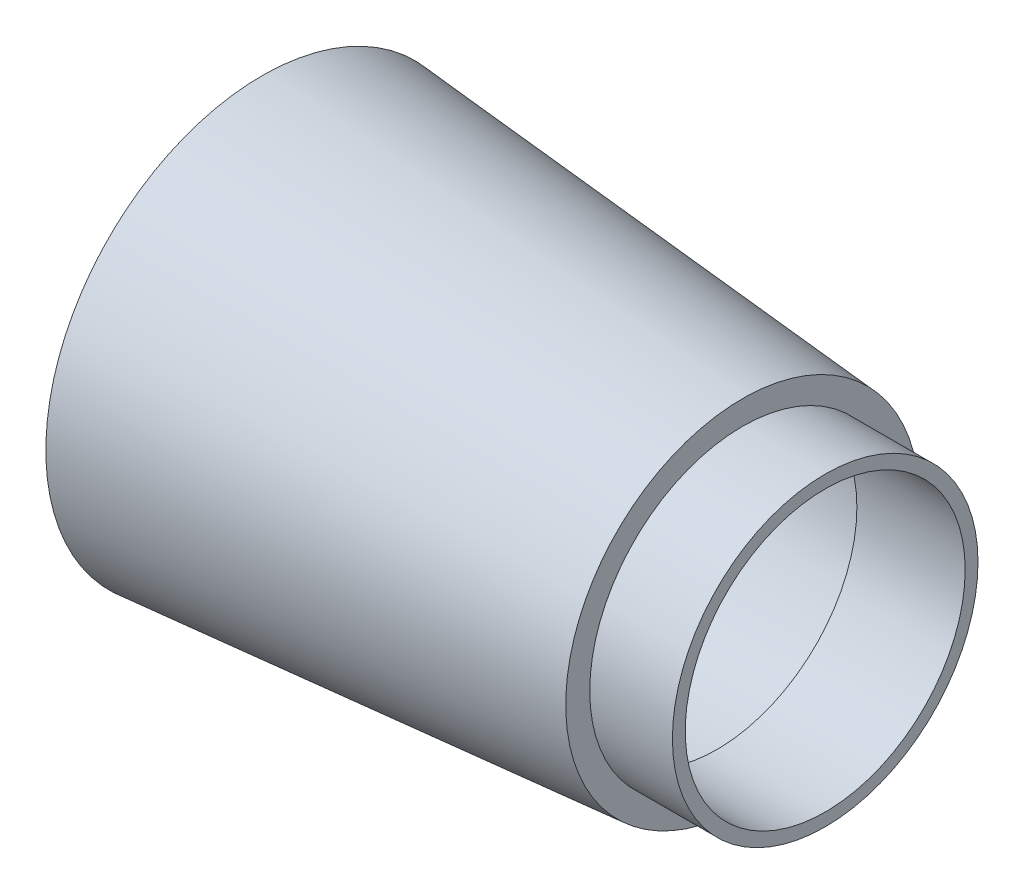
ISO-10303-21;
HEADER;
FILE_DESCRIPTION(('STEP AP214'),'2;1');
FILE_NAME('part.step','',(''),(''),'','','');
FILE_SCHEMA(('AUTOMOTIVE_DESIGN { 1 0 10303 214 1 1 1 1 }'));
ENDSEC;
DATA;
#1=APPLICATION_CONTEXT('core data for automotive mechanical design processes');
#2=APPLICATION_PROTOCOL_DEFINITION('international standard','automotive_design',2000,#1);
#3=PRODUCT_CONTEXT('',#1,'mechanical');
#4=PRODUCT('Part','Part','',(#3));
#5=PRODUCT_RELATED_PRODUCT_CATEGORY('part','',(#4));
#6=PRODUCT_DEFINITION_FORMATION('','',#4);
#7=PRODUCT_DEFINITION_CONTEXT('part definition',#1,'design');
#8=PRODUCT_DEFINITION('design','',#6,#7);
#9=PRODUCT_DEFINITION_SHAPE('','',#8);
#10=(LENGTH_UNIT() NAMED_UNIT(*) SI_UNIT(.MILLI.,.METRE.));
#11=(NAMED_UNIT(*) PLANE_ANGLE_UNIT() SI_UNIT($,.RADIAN.));
#12=(NAMED_UNIT(*) SI_UNIT($,.STERADIAN.) SOLID_ANGLE_UNIT());
#13=UNCERTAINTY_MEASURE_WITH_UNIT(LENGTH_MEASURE(1.E-05),#10,'distance_accuracy_value','');
#14=(GEOMETRIC_REPRESENTATION_CONTEXT(3) GLOBAL_UNCERTAINTY_ASSIGNED_CONTEXT((#13)) GLOBAL_UNIT_ASSIGNED_CONTEXT((#10,
#11,#12)) REPRESENTATION_CONTEXT('',''));
#15=CARTESIAN_POINT('',(0.,0.,0.));
#16=DIRECTION('',(0.,0.,1.));
#17=DIRECTION('',(1.,0.,0.));
#18=AXIS2_PLACEMENT_3D('',#15,#16,#17);
#19=CARTESIAN_POINT('',(-12.065,0.,0.));
#20=DIRECTION('',(-1.,0.,0.));
#21=DIRECTION('',(0.,0.,1.));
#22=AXIS2_PLACEMENT_3D('',#19,#20,#21);
#23=PLANE('',#22);
#24=CARTESIAN_POINT('',(-12.065,0.,0.));
#25=DIRECTION('',(1.,0.,0.));
#26=DIRECTION('',(0.,0.,-1.));
#27=AXIS2_PLACEMENT_3D('',#24,#25,#26);
#28=CIRCLE('',#27,10.16);
#29=CARTESIAN_POINT('',(-12.065,0.,-10.16));
#30=VERTEX_POINT('',#29);
#31=EDGE_CURVE('E11',#30,#30,#28,.T.);
#32=ORIENTED_EDGE('',*,*,#31,.T.);
#33=EDGE_LOOP('',(#32));
#34=FACE_BOUND('',#33,.T.);
#35=CARTESIAN_POINT('',(-12.065,0.,0.));
#36=DIRECTION('',(1.,0.,0.));
#37=DIRECTION('',(0.,0.,-1.));
#38=AXIS2_PLACEMENT_3D('',#35,#36,#37);
#39=CIRCLE('',#38,11.43);
#40=CARTESIAN_POINT('',(-12.065,0.,-11.43));
#41=VERTEX_POINT('',#40);
#42=EDGE_CURVE('E137',#41,#41,#39,.T.);
#43=ORIENTED_EDGE('',*,*,#42,.F.);
#44=EDGE_LOOP('',(#43));
#45=FACE_BOUND('',#44,.T.);
#46=ADVANCED_FACE('F47',(#34,#45),#23,.T.);
#47=CARTESIAN_POINT('',(-12.065,0.,0.));
#48=DIRECTION('',(-1.,0.,0.));
#49=DIRECTION('',(0.,0.,1.));
#50=AXIS2_PLACEMENT_3D('',#47,#48,#49);
#51=CONICAL_SURFACE('',#50,10.16,0.0818169486036547);
#52=CARTESIAN_POINT('',(-1.07926936310474,0.,0.));
#53=DIRECTION('',(1.,0.,0.));
#54=DIRECTION('',(0.,0.,-1.));
#55=AXIS2_PLACEMENT_3D('',#52,#53,#54);
#56=CIRCLE('',#55,9.25917008777458);
#57=CARTESIAN_POINT('',(-1.07926936310474,0.,-9.25917008777458));
#58=VERTEX_POINT('',#57);
#59=EDGE_CURVE('E57',#58,#58,#56,.T.);
#60=ORIENTED_EDGE('',*,*,#59,.T.);
#61=EDGE_LOOP('',(#60));
#62=FACE_BOUND('',#61,.T.);
#63=ORIENTED_EDGE('',*,*,#31,.F.);
#64=EDGE_LOOP('',(#63));
#65=FACE_BOUND('',#64,.T.);
#66=ADVANCED_FACE('F188',(#62,#65),#51,.F.);
#67=CARTESIAN_POINT('',(-1.07926936310474,0.,0.));
#68=DIRECTION('',(-1.,0.,0.));
#69=DIRECTION('',(0.,0.,1.));
#70=AXIS2_PLACEMENT_3D('',#67,#68,#69);
#71=CONICAL_SURFACE('',#70,10.5291700877746,0.0818169486036545);
#72=ORIENTED_EDGE('',*,*,#42,.T.);
#73=EDGE_LOOP('',(#72));
#74=FACE_BOUND('',#73,.T.);
#75=CARTESIAN_POINT('',(13.335,0.,0.));
#76=DIRECTION('',(1.,0.,0.));
#77=DIRECTION('',(0.,0.,-1.));
#78=AXIS2_PLACEMENT_3D('',#75,#76,#77);
#79=CIRCLE('',#78,9.3472);
#80=CARTESIAN_POINT('',(13.335,0.,-9.3472));
#81=VERTEX_POINT('',#80);
#82=EDGE_CURVE('E149',#81,#81,#79,.T.);
#83=ORIENTED_EDGE('',*,*,#82,.F.);
#84=EDGE_LOOP('',(#83));
#85=FACE_BOUND('',#84,.T.);
#86=ADVANCED_FACE('F186',(#74,#85),#71,.T.);
#87=CARTESIAN_POINT('',(0.634999999999998,0.,0.));
#88=DIRECTION('',(1.,0.,0.));
#89=DIRECTION('',(0.,0.,-1.));
#90=AXIS2_PLACEMENT_3D('',#87,#88,#89);
#91=PLANE('',#90);
#92=DIRECTION('',(0.,1.,0.));
#93=VECTOR('',#92,1.);
#94=CARTESIAN_POINT('',(0.634999999999998,0.,0.312874155984692));
#95=LINE('',#94,#93);
#96=CARTESIAN_POINT('',(0.634999999999998,0.786275154936789,0.312874155984692));
#97=VERTEX_POINT('',#96);
#98=CARTESIAN_POINT('',(0.634999999999998,1.00817587704619,0.312874155984692));
#99=VERTEX_POINT('',#98);
#100=EDGE_CURVE('E88',#97,#99,#95,.T.);
#101=ORIENTED_EDGE('',*,*,#100,.T.);
#102=DIRECTION('',(0.,0.,-1.));
#103=VECTOR('',#102,1.);
#104=CARTESIAN_POINT('',(0.634999999999998,1.00817587704619,0.));
#105=LINE('',#104,#103);
#106=CARTESIAN_POINT('',(0.634999999999998,1.00817587704619,-0.312874155984692));
#107=VERTEX_POINT('',#106);
#108=EDGE_CURVE('E93',#99,#107,#105,.T.);
#109=ORIENTED_EDGE('',*,*,#108,.T.);
#110=DIRECTION('',(0.,1.,0.));
#111=VECTOR('',#110,1.);
#112=CARTESIAN_POINT('',(0.634999999999998,0.,-0.312874155984692));
#113=LINE('',#112,#111);
#114=CARTESIAN_POINT('',(0.634999999999998,0.786275154936789,-0.312874155984692));
#115=VERTEX_POINT('',#114);
#116=EDGE_CURVE('E70',#115,#107,#113,.T.);
#117=ORIENTED_EDGE('',*,*,#116,.F.);
#118=DIRECTION('',(0.,0.,-1.));
#119=VECTOR('',#118,1.);
#120=CARTESIAN_POINT('',(0.634999999999998,0.786275154936789,0.));
#121=LINE('',#120,#119);
#122=EDGE_CURVE('E65',#97,#115,#121,.T.);
#123=ORIENTED_EDGE('',*,*,#122,.F.);
#124=EDGE_LOOP('',(#101,#109,#117,#123));
#125=FACE_BOUND('',#124,.T.);
#126=DIRECTION('',(0.,-1.,0.));
#127=VECTOR('',#126,1.);
#128=CARTESIAN_POINT('',(0.634999999999998,0.,0.312874155984692));
#129=LINE('',#128,#127);
#130=CARTESIAN_POINT('',(0.634999999999998,-0.786275154936789,0.312874155984692));
#131=VERTEX_POINT('',#130);
#132=CARTESIAN_POINT('',(0.634999999999998,-1.00817587704619,0.312874155984692));
#133=VERTEX_POINT('',#132);
#134=EDGE_CURVE('E103',#131,#133,#129,.T.);
#135=ORIENTED_EDGE('',*,*,#134,.F.);
#136=DIRECTION('',(0.,0.,-1.));
#137=VECTOR('',#136,1.);
#138=CARTESIAN_POINT('',(0.634999999999992,-0.786275154936789,0.));
#139=LINE('',#138,#137);
#140=CARTESIAN_POINT('',(0.634999999999998,-0.786275154936789,-0.312874155984692));
#141=VERTEX_POINT('',#140);
#142=EDGE_CURVE('E116',#131,#141,#139,.T.);
#143=ORIENTED_EDGE('',*,*,#142,.T.);
#144=DIRECTION('',(0.,-1.,0.));
#145=VECTOR('',#144,1.);
#146=CARTESIAN_POINT('',(0.634999999999998,0.,-0.312874155984692));
#147=LINE('',#146,#145);
#148=CARTESIAN_POINT('',(0.634999999999991,-1.00817587704619,-0.312874155984692));
#149=VERTEX_POINT('',#148);
#150=EDGE_CURVE('E123',#141,#149,#147,.T.);
#151=ORIENTED_EDGE('',*,*,#150,.T.);
#152=DIRECTION('',(0.,0.,-1.));
#153=VECTOR('',#152,1.);
#154=CARTESIAN_POINT('',(0.634999999999991,-1.00817587704619,0.));
#155=LINE('',#154,#153);
#156=EDGE_CURVE('E108',#133,#149,#155,.T.);
#157=ORIENTED_EDGE('',*,*,#156,.F.);
#158=EDGE_LOOP('',(#135,#143,#151,#157));
#159=FACE_BOUND('',#158,.T.);
#160=CARTESIAN_POINT('',(0.634999999999997,0.,0.));
#161=DIRECTION('',(1.,0.,0.));
#162=DIRECTION('',(0.,0.,-1.));
#163=AXIS2_PLACEMENT_3D('',#160,#161,#162);
#164=CIRCLE('',#163,9.11859999999999);
#165=CARTESIAN_POINT('',(0.634999999999997,0.,-9.11859999999999));
#166=VERTEX_POINT('',#165);
#167=EDGE_CURVE('E141',#166,#166,#164,.T.);
#168=ORIENTED_EDGE('',*,*,#167,.T.);
#169=EDGE_LOOP('',(#168));
#170=FACE_BOUND('',#169,.T.);
#171=ADVANCED_FACE('F90',(#125,#159,#170),#91,.T.);
#172=CARTESIAN_POINT('',(0.634999999999997,0.,0.));
#173=DIRECTION('',(-1.,0.,0.));
#174=DIRECTION('',(0.,0.,1.));
#175=AXIS2_PLACEMENT_3D('',#172,#173,#174);
#176=CONICAL_SURFACE('',#175,9.11859999999999,0.0818169486036544);
#177=ORIENTED_EDGE('',*,*,#167,.F.);
#178=EDGE_LOOP('',(#177));
#179=FACE_BOUND('',#178,.T.);
#180=CARTESIAN_POINT('',(11.9799826709182,0.,0.));
#181=DIRECTION('',(1.,0.,0.));
#182=DIRECTION('',(0.,0.,-1.));
#183=AXIS2_PLACEMENT_3D('',#180,#181,#182);
#184=CIRCLE('',#183,8.1883114209847);
#185=CARTESIAN_POINT('',(11.9799826709182,0.,-8.1883114209847));
#186=VERTEX_POINT('',#185);
#187=EDGE_CURVE('E148',#186,#186,#184,.T.);
#188=ORIENTED_EDGE('',*,*,#187,.T.);
#189=EDGE_LOOP('',(#188));
#190=FACE_BOUND('',#189,.T.);
#191=ADVANCED_FACE('F182',(#179,#190),#176,.F.);
#192=CARTESIAN_POINT('',(11.9799826709182,7.39955978153455,0.));
#193=DIRECTION('',(1.,0.,0.));
#194=DIRECTION('',(0.,0.,-1.));
#195=AXIS2_PLACEMENT_3D('',#192,#193,#194);
#196=PLANE('',#195);
#197=ORIENTED_EDGE('',*,*,#187,.F.);
#198=EDGE_LOOP('',(#197));
#199=FACE_BOUND('',#198,.T.);
#200=CARTESIAN_POINT('',(11.9799826709182,0.,0.));
#201=DIRECTION('',(1.,0.,0.));
#202=DIRECTION('',(0.,0.,-1.));
#203=AXIS2_PLACEMENT_3D('',#200,#201,#202);
#204=CIRCLE('',#203,7.39955978153455);
#205=CARTESIAN_POINT('',(11.9799826709182,0.,-7.39955978153455));
#206=VERTEX_POINT('',#205);
#207=EDGE_CURVE('E136',#206,#206,#204,.T.);
#208=ORIENTED_EDGE('',*,*,#207,.T.);
#209=EDGE_LOOP('',(#208));
#210=FACE_BOUND('',#209,.T.);
#211=ADVANCED_FACE('F183',(#199,#210),#196,.F.);
#212=CARTESIAN_POINT('',(44.7264408045133,0.,0.));
#213=DIRECTION('',(1.,0.,0.));
#214=DIRECTION('',(0.,0.,-1.));
#215=AXIS2_PLACEMENT_3D('',#212,#213,#214);
#216=CYLINDRICAL_SURFACE('',#215,7.39955978153455);
#217=ORIENTED_EDGE('',*,*,#207,.F.);
#218=EDGE_LOOP('',(#217));
#219=FACE_BOUND('',#218,.T.);
#220=CARTESIAN_POINT('',(17.7045590163144,0.,0.));
#221=DIRECTION('',(1.,0.,0.));
#222=DIRECTION('',(0.,0.,-1.));
#223=AXIS2_PLACEMENT_3D('',#220,#221,#222);
#224=CIRCLE('',#223,7.39955978153455);
#225=CARTESIAN_POINT('',(17.7045590163144,0.,-7.39955978153455));
#226=VERTEX_POINT('',#225);
#227=EDGE_CURVE('E162',#226,#226,#224,.T.);
#228=ORIENTED_EDGE('',*,*,#227,.T.);
#229=EDGE_LOOP('',(#228));
#230=FACE_BOUND('',#229,.T.);
#231=ADVANCED_FACE('F215',(#219,#230),#216,.F.);
#232=CARTESIAN_POINT('',(17.7045590163144,8.0772,0.));
#233=DIRECTION('',(-1.,0.,0.));
#234=DIRECTION('',(0.,0.,1.));
#235=AXIS2_PLACEMENT_3D('',#232,#233,#234);
#236=PLANE('',#235);
#237=ORIENTED_EDGE('',*,*,#227,.F.);
#238=EDGE_LOOP('',(#237));
#239=FACE_BOUND('',#238,.T.);
#240=CARTESIAN_POINT('',(17.7045590163144,0.,0.));
#241=DIRECTION('',(1.,0.,0.));
#242=DIRECTION('',(0.,0.,-1.));
#243=AXIS2_PLACEMENT_3D('',#240,#241,#242);
#244=CIRCLE('',#243,8.0772);
#245=CARTESIAN_POINT('',(17.7045590163144,0.,-8.0772));
#246=VERTEX_POINT('',#245);
#247=EDGE_CURVE('E51',#246,#246,#244,.T.);
#248=ORIENTED_EDGE('',*,*,#247,.T.);
#249=EDGE_LOOP('',(#248));
#250=FACE_BOUND('',#249,.T.);
#251=ADVANCED_FACE('F171',(#239,#250),#236,.F.);
#252=CARTESIAN_POINT('',(44.7264408045133,0.,0.));
#253=DIRECTION('',(1.,0.,0.));
#254=DIRECTION('',(0.,0.,-1.));
#255=AXIS2_PLACEMENT_3D('',#252,#253,#254);
#256=CYLINDRICAL_SURFACE('',#255,8.0772);
#257=ORIENTED_EDGE('',*,*,#247,.F.);
#258=EDGE_LOOP('',(#257));
#259=FACE_BOUND('',#258,.T.);
#260=CARTESIAN_POINT('',(13.335,0.,0.));
#261=DIRECTION('',(1.,0.,0.));
#262=DIRECTION('',(0.,0.,-1.));
#263=AXIS2_PLACEMENT_3D('',#260,#261,#262);
#264=CIRCLE('',#263,8.0772);
#265=CARTESIAN_POINT('',(13.335,0.,-8.0772));
#266=VERTEX_POINT('',#265);
#267=EDGE_CURVE('E153',#266,#266,#264,.T.);
#268=ORIENTED_EDGE('',*,*,#267,.T.);
#269=EDGE_LOOP('',(#268));
#270=FACE_BOUND('',#269,.T.);
#271=ADVANCED_FACE('F49',(#259,#270),#256,.T.);
#272=CARTESIAN_POINT('',(13.335,0.,0.));
#273=DIRECTION('',(-1.,0.,0.));
#274=DIRECTION('',(0.,0.,1.));
#275=AXIS2_PLACEMENT_3D('',#272,#273,#274);
#276=PLANE('',#275);
#277=ORIENTED_EDGE('',*,*,#267,.F.);
#278=EDGE_LOOP('',(#277));
#279=FACE_BOUND('',#278,.T.);
#280=ORIENTED_EDGE('',*,*,#82,.T.);
#281=EDGE_LOOP('',(#280));
#282=FACE_BOUND('',#281,.T.);
#283=ADVANCED_FACE('F175',(#279,#282),#276,.F.);
#284=CARTESIAN_POINT('',(-1.07926936310474,0.,0.));
#285=DIRECTION('',(-1.,0.,0.));
#286=DIRECTION('',(0.,0.,1.));
#287=AXIS2_PLACEMENT_3D('',#284,#285,#286);
#288=PLANE('',#287);
#289=ORIENTED_EDGE('',*,*,#59,.F.);
#290=EDGE_LOOP('',(#289));
#291=FACE_BOUND('',#290,.T.);
#292=ADVANCED_FACE('F180',(#291),#288,.T.);
#293=CARTESIAN_POINT('',(0.634999999999998,0.,0.312874155984692));
#294=DIRECTION('',(0.,0.,1.));
#295=DIRECTION('',(1.,0.,0.));
#296=AXIS2_PLACEMENT_3D('',#293,#294,#295);
#297=PLANE('',#296);
#298=CARTESIAN_POINT('',(0.634999999999998,0.,0.312874155984692));
#299=DIRECTION('',(0.,0.,1.));
#300=DIRECTION('',(1.,0.,0.));
#301=AXIS2_PLACEMENT_3D('',#298,#299,#300);
#302=CIRCLE('',#301,0.786275154936789);
#303=EDGE_CURVE('E133',#131,#97,#302,.T.);
#304=ORIENTED_EDGE('',*,*,#303,.F.);
#305=ORIENTED_EDGE('',*,*,#134,.T.);
#306=CARTESIAN_POINT('',(0.634999999999998,0.,0.312874155984692));
#307=DIRECTION('',(0.,0.,1.));
#308=DIRECTION('',(1.,0.,0.));
#309=AXIS2_PLACEMENT_3D('',#306,#307,#308);
#310=CIRCLE('',#309,1.00817587704619);
#311=EDGE_CURVE('E101',#133,#99,#310,.T.);
#312=ORIENTED_EDGE('',*,*,#311,.T.);
#313=ORIENTED_EDGE('',*,*,#100,.F.);
#314=EDGE_LOOP('',(#304,#305,#312,#313));
#315=FACE_BOUND('',#314,.T.);
#316=ADVANCED_FACE('F102',(#315),#297,.T.);
#317=CARTESIAN_POINT('',(0.634999999999998,0.,0.312874155984692));
#318=DIRECTION('',(0.,0.,1.));
#319=DIRECTION('',(1.,0.,0.));
#320=AXIS2_PLACEMENT_3D('',#317,#318,#319);
#321=CYLINDRICAL_SURFACE('',#320,0.786275154936789);
#322=CARTESIAN_POINT('',(0.634999999999998,0.,-0.312874155984692));
#323=DIRECTION('',(0.,0.,1.));
#324=DIRECTION('',(1.,0.,0.));
#325=AXIS2_PLACEMENT_3D('',#322,#323,#324);
#326=CIRCLE('',#325,0.786275154936789);
#327=EDGE_CURVE('E130',#141,#115,#326,.T.);
#328=ORIENTED_EDGE('',*,*,#327,.F.);
#329=ORIENTED_EDGE('',*,*,#142,.F.);
#330=ORIENTED_EDGE('',*,*,#303,.T.);
#331=ORIENTED_EDGE('',*,*,#122,.T.);
#332=EDGE_LOOP('',(#328,#329,#330,#331));
#333=FACE_BOUND('',#332,.T.);
#334=ADVANCED_FACE('F206',(#333),#321,.F.);
#335=CARTESIAN_POINT('',(0.634999999999998,0.,-0.312874155984692));
#336=DIRECTION('',(0.,0.,1.));
#337=DIRECTION('',(1.,0.,0.));
#338=AXIS2_PLACEMENT_3D('',#335,#336,#337);
#339=PLANE('',#338);
#340=CARTESIAN_POINT('',(0.634999999999998,0.,-0.312874155984692));
#341=DIRECTION('',(0.,0.,1.));
#342=DIRECTION('',(1.,0.,0.));
#343=AXIS2_PLACEMENT_3D('',#340,#341,#342);
#344=CIRCLE('',#343,1.00817587704619);
#345=EDGE_CURVE('E107',#149,#107,#344,.T.);
#346=ORIENTED_EDGE('',*,*,#345,.F.);
#347=ORIENTED_EDGE('',*,*,#150,.F.);
#348=ORIENTED_EDGE('',*,*,#327,.T.);
#349=ORIENTED_EDGE('',*,*,#116,.T.);
#350=EDGE_LOOP('',(#346,#347,#348,#349));
#351=FACE_BOUND('',#350,.T.);
#352=ADVANCED_FACE('F261',(#351),#339,.F.);
#353=CARTESIAN_POINT('',(0.634999999999998,0.,0.312874155984692));
#354=DIRECTION('',(0.,0.,1.));
#355=DIRECTION('',(1.,0.,0.));
#356=AXIS2_PLACEMENT_3D('',#353,#354,#355);
#357=CYLINDRICAL_SURFACE('',#356,1.00817587704619);
#358=ORIENTED_EDGE('',*,*,#156,.T.);
#359=ORIENTED_EDGE('',*,*,#345,.T.);
#360=ORIENTED_EDGE('',*,*,#108,.F.);
#361=ORIENTED_EDGE('',*,*,#311,.F.);
#362=EDGE_LOOP('',(#358,#359,#360,#361));
#363=FACE_BOUND('',#362,.T.);
#364=ADVANCED_FACE('F110',(#363),#357,.T.);
#365=CLOSED_SHELL('',(#46,#66,#86,#171,#191,#211,#231,#251,#271,#283,#292,#316,#334,#352,#364));
#366=MANIFOLD_SOLID_BREP('B2',#365);
#367=ADVANCED_BREP_SHAPE_REPRESENTATION('',(#18,#366),#14);
#368=SHAPE_DEFINITION_REPRESENTATION(#9,#367);
ENDSEC;
END-ISO-10303-21;
